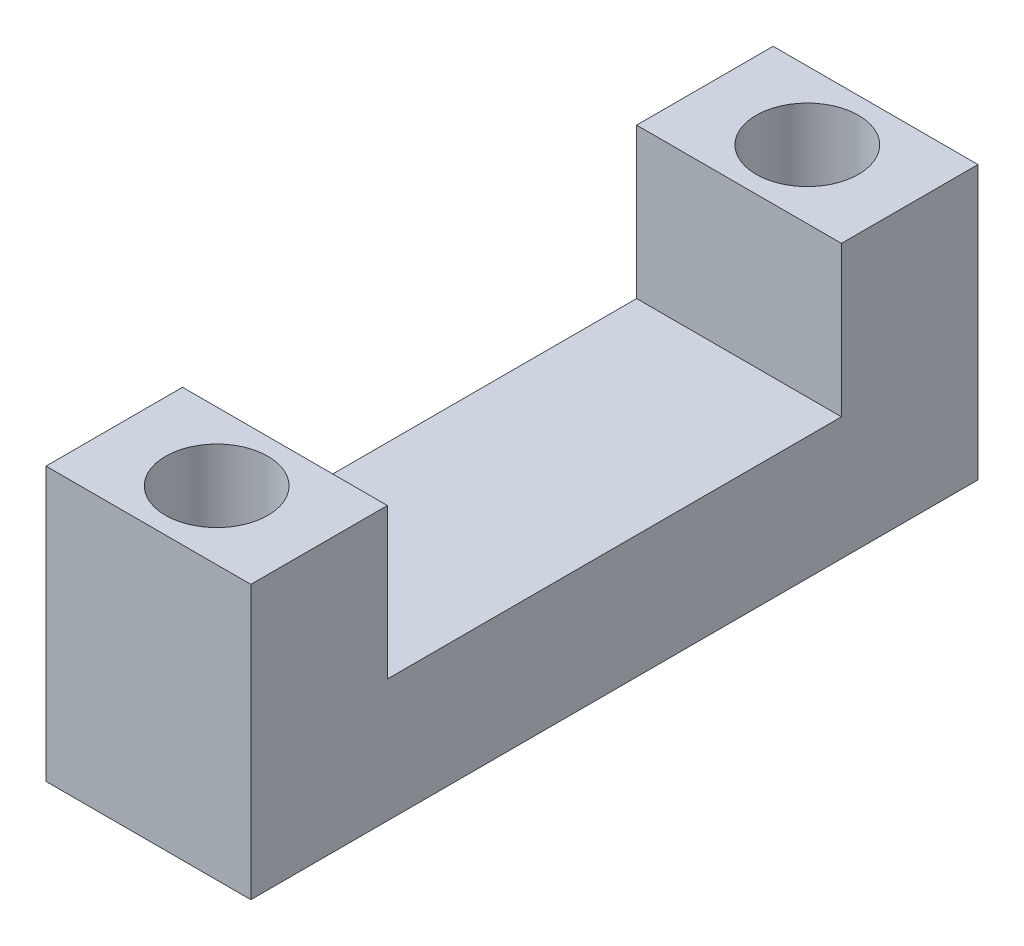
ISO-10303-21;
HEADER;
FILE_DESCRIPTION(('STEP AP214'),'2;1');
FILE_NAME('part.step','',(''),(''),'','','');
FILE_SCHEMA(('AUTOMOTIVE_DESIGN { 1 0 10303 214 1 1 1 1 }'));
ENDSEC;
DATA;
#1=APPLICATION_CONTEXT('core data for automotive mechanical design processes');
#2=APPLICATION_PROTOCOL_DEFINITION('international standard','automotive_design',2000,#1);
#3=PRODUCT_CONTEXT('',#1,'mechanical');
#4=PRODUCT('Part','Part','',(#3));
#5=PRODUCT_RELATED_PRODUCT_CATEGORY('part','',(#4));
#6=PRODUCT_DEFINITION_FORMATION('','',#4);
#7=PRODUCT_DEFINITION_CONTEXT('part definition',#1,'design');
#8=PRODUCT_DEFINITION('design','',#6,#7);
#9=PRODUCT_DEFINITION_SHAPE('','',#8);
#10=(LENGTH_UNIT() NAMED_UNIT(*) SI_UNIT(.MILLI.,.METRE.));
#11=(NAMED_UNIT(*) PLANE_ANGLE_UNIT() SI_UNIT($,.RADIAN.));
#12=(NAMED_UNIT(*) SI_UNIT($,.STERADIAN.) SOLID_ANGLE_UNIT());
#13=UNCERTAINTY_MEASURE_WITH_UNIT(LENGTH_MEASURE(1.E-05),#10,'distance_accuracy_value','');
#14=(GEOMETRIC_REPRESENTATION_CONTEXT(3) GLOBAL_UNCERTAINTY_ASSIGNED_CONTEXT((#13)) GLOBAL_UNIT_ASSIGNED_CONTEXT((#10,
#11,#12)) REPRESENTATION_CONTEXT('',''));
#15=CARTESIAN_POINT('',(0.,0.,0.));
#16=DIRECTION('',(0.,0.,1.));
#17=DIRECTION('',(1.,0.,0.));
#18=AXIS2_PLACEMENT_3D('',#15,#16,#17);
#19=CARTESIAN_POINT('',(6.,0.,-21.3));
#20=DIRECTION('',(0.,1.,0.));
#21=DIRECTION('',(0.,0.,1.));
#22=AXIS2_PLACEMENT_3D('',#19,#20,#21);
#23=PLANE('',#22);
#24=CARTESIAN_POINT('',(3.,0.,-2.));
#25=DIRECTION('',(0.,1.,0.));
#26=DIRECTION('',(0.,0.,1.));
#27=AXIS2_PLACEMENT_3D('',#24,#25,#26);
#28=CIRCLE('',#27,1.5);
#29=CARTESIAN_POINT('',(3.,0.,-0.500000000000002));
#30=VERTEX_POINT('',#29);
#31=EDGE_CURVE('E185',#30,#30,#28,.T.);
#32=ORIENTED_EDGE('',*,*,#31,.T.);
#33=EDGE_LOOP('',(#32));
#34=FACE_BOUND('',#33,.T.);
#35=CARTESIAN_POINT('',(3.,0.,-19.3));
#36=DIRECTION('',(0.,1.,0.));
#37=DIRECTION('',(0.,0.,1.));
#38=AXIS2_PLACEMENT_3D('',#35,#36,#37);
#39=CIRCLE('',#38,1.5);
#40=CARTESIAN_POINT('',(3.,0.,-17.8));
#41=VERTEX_POINT('',#40);
#42=EDGE_CURVE('E136',#41,#41,#39,.T.);
#43=ORIENTED_EDGE('',*,*,#42,.T.);
#44=EDGE_LOOP('',(#43));
#45=FACE_BOUND('',#44,.T.);
#46=DIRECTION('',(0.,0.,-1.));
#47=VECTOR('',#46,1.);
#48=CARTESIAN_POINT('',(0.,0.,-21.3));
#49=LINE('',#48,#47);
#50=CARTESIAN_POINT('',(0.,0.,0.));
#51=VERTEX_POINT('',#50);
#52=CARTESIAN_POINT('',(0.,0.,-21.3));
#53=VERTEX_POINT('',#52);
#54=EDGE_CURVE('E132',#51,#53,#49,.T.);
#55=ORIENTED_EDGE('',*,*,#54,.T.);
#56=DIRECTION('',(-1.,0.,0.));
#57=VECTOR('',#56,1.);
#58=CARTESIAN_POINT('',(6.,0.,-21.3));
#59=LINE('',#58,#57);
#60=CARTESIAN_POINT('',(6.,0.,-21.3));
#61=VERTEX_POINT('',#60);
#62=EDGE_CURVE('E11',#61,#53,#59,.T.);
#63=ORIENTED_EDGE('',*,*,#62,.F.);
#64=DIRECTION('',(0.,0.,-1.));
#65=VECTOR('',#64,1.);
#66=CARTESIAN_POINT('',(6.,0.,-21.3));
#67=LINE('',#66,#65);
#68=CARTESIAN_POINT('',(6.,0.,0.));
#69=VERTEX_POINT('',#68);
#70=EDGE_CURVE('E147',#69,#61,#67,.T.);
#71=ORIENTED_EDGE('',*,*,#70,.F.);
#72=DIRECTION('',(-1.,0.,0.));
#73=VECTOR('',#72,1.);
#74=CARTESIAN_POINT('',(6.,0.,0.));
#75=LINE('',#74,#73);
#76=EDGE_CURVE('E128',#69,#51,#75,.T.);
#77=ORIENTED_EDGE('',*,*,#76,.T.);
#78=EDGE_LOOP('',(#55,#63,#71,#77));
#79=FACE_BOUND('',#78,.T.);
#80=ADVANCED_FACE('F36',(#34,#45,#79),#23,.F.);
#81=CARTESIAN_POINT('',(6.,8.,-21.3));
#82=DIRECTION('',(0.,0.,1.));
#83=DIRECTION('',(0.,-1.,0.));
#84=AXIS2_PLACEMENT_3D('',#81,#82,#83);
#85=PLANE('',#84);
#86=DIRECTION('',(0.,1.,0.));
#87=VECTOR('',#86,1.);
#88=CARTESIAN_POINT('',(0.,8.,-21.3));
#89=LINE('',#88,#87);
#90=CARTESIAN_POINT('',(0.,8.,-21.3));
#91=VERTEX_POINT('',#90);
#92=EDGE_CURVE('E135',#53,#91,#89,.T.);
#93=ORIENTED_EDGE('',*,*,#92,.T.);
#94=DIRECTION('',(-1.,0.,0.));
#95=VECTOR('',#94,1.);
#96=CARTESIAN_POINT('',(6.,8.,-21.3));
#97=LINE('',#96,#95);
#98=CARTESIAN_POINT('',(6.,8.,-21.3));
#99=VERTEX_POINT('',#98);
#100=EDGE_CURVE('E44',#99,#91,#97,.T.);
#101=ORIENTED_EDGE('',*,*,#100,.F.);
#102=DIRECTION('',(0.,1.,0.));
#103=VECTOR('',#102,1.);
#104=CARTESIAN_POINT('',(6.,8.,-21.3));
#105=LINE('',#104,#103);
#106=EDGE_CURVE('E95',#61,#99,#105,.T.);
#107=ORIENTED_EDGE('',*,*,#106,.F.);
#108=ORIENTED_EDGE('',*,*,#62,.T.);
#109=EDGE_LOOP('',(#93,#101,#107,#108));
#110=FACE_BOUND('',#109,.T.);
#111=ADVANCED_FACE('F204',(#110),#85,.F.);
#112=CARTESIAN_POINT('',(6.,8.,-17.3));
#113=DIRECTION('',(0.,-1.,0.));
#114=DIRECTION('',(0.,0.,-1.));
#115=AXIS2_PLACEMENT_3D('',#112,#113,#114);
#116=PLANE('',#115);
#117=CARTESIAN_POINT('',(3.,8.,-19.3));
#118=DIRECTION('',(0.,1.,0.));
#119=DIRECTION('',(0.,0.,1.));
#120=AXIS2_PLACEMENT_3D('',#117,#118,#119);
#121=CIRCLE('',#120,1.5);
#122=CARTESIAN_POINT('',(3.,8.,-17.8));
#123=VERTEX_POINT('',#122);
#124=EDGE_CURVE('E182',#123,#123,#121,.T.);
#125=ORIENTED_EDGE('',*,*,#124,.F.);
#126=EDGE_LOOP('',(#125));
#127=FACE_BOUND('',#126,.T.);
#128=DIRECTION('',(0.,0.,1.));
#129=VECTOR('',#128,1.);
#130=CARTESIAN_POINT('',(0.,8.,-17.3));
#131=LINE('',#130,#129);
#132=CARTESIAN_POINT('',(0.,8.,-17.3));
#133=VERTEX_POINT('',#132);
#134=EDGE_CURVE('E138',#91,#133,#131,.T.);
#135=ORIENTED_EDGE('',*,*,#134,.T.);
#136=DIRECTION('',(-1.,0.,0.));
#137=VECTOR('',#136,1.);
#138=CARTESIAN_POINT('',(6.,8.,-17.3));
#139=LINE('',#138,#137);
#140=CARTESIAN_POINT('',(6.,8.,-17.3));
#141=VERTEX_POINT('',#140);
#142=EDGE_CURVE('E154',#141,#133,#139,.T.);
#143=ORIENTED_EDGE('',*,*,#142,.F.);
#144=DIRECTION('',(0.,0.,1.));
#145=VECTOR('',#144,1.);
#146=CARTESIAN_POINT('',(6.,8.,-17.3));
#147=LINE('',#146,#145);
#148=EDGE_CURVE('E162',#99,#141,#147,.T.);
#149=ORIENTED_EDGE('',*,*,#148,.F.);
#150=ORIENTED_EDGE('',*,*,#100,.T.);
#151=EDGE_LOOP('',(#135,#143,#149,#150));
#152=FACE_BOUND('',#151,.T.);
#153=ADVANCED_FACE('F160',(#127,#152),#116,.F.);
#154=CARTESIAN_POINT('',(6.,3.6,-17.3));
#155=DIRECTION('',(0.,0.,-1.));
#156=DIRECTION('',(-1.,0.,0.));
#157=AXIS2_PLACEMENT_3D('',#154,#155,#156);
#158=PLANE('',#157);
#159=DIRECTION('',(0.,-1.,0.));
#160=VECTOR('',#159,1.);
#161=CARTESIAN_POINT('',(0.,3.6,-17.3));
#162=LINE('',#161,#160);
#163=CARTESIAN_POINT('',(0.,3.6,-17.3));
#164=VERTEX_POINT('',#163);
#165=EDGE_CURVE('E140',#133,#164,#162,.T.);
#166=ORIENTED_EDGE('',*,*,#165,.T.);
#167=DIRECTION('',(-1.,0.,0.));
#168=VECTOR('',#167,1.);
#169=CARTESIAN_POINT('',(6.,3.6,-17.3));
#170=LINE('',#169,#168);
#171=CARTESIAN_POINT('',(6.,3.6,-17.3));
#172=VERTEX_POINT('',#171);
#173=EDGE_CURVE('E151',#172,#164,#170,.T.);
#174=ORIENTED_EDGE('',*,*,#173,.F.);
#175=DIRECTION('',(0.,-1.,0.));
#176=VECTOR('',#175,1.);
#177=CARTESIAN_POINT('',(6.,3.6,-17.3));
#178=LINE('',#177,#176);
#179=EDGE_CURVE('E174',#141,#172,#178,.T.);
#180=ORIENTED_EDGE('',*,*,#179,.F.);
#181=ORIENTED_EDGE('',*,*,#142,.T.);
#182=EDGE_LOOP('',(#166,#174,#180,#181));
#183=FACE_BOUND('',#182,.T.);
#184=ADVANCED_FACE('F170',(#183),#158,.F.);
#185=CARTESIAN_POINT('',(6.,3.6,-4.));
#186=DIRECTION('',(0.,-1.,0.));
#187=DIRECTION('',(0.,0.,-1.));
#188=AXIS2_PLACEMENT_3D('',#185,#186,#187);
#189=PLANE('',#188);
#190=DIRECTION('',(0.,0.,1.));
#191=VECTOR('',#190,1.);
#192=CARTESIAN_POINT('',(0.,3.6,-4.));
#193=LINE('',#192,#191);
#194=CARTESIAN_POINT('',(0.,3.6,-4.));
#195=VERTEX_POINT('',#194);
#196=EDGE_CURVE('E142',#164,#195,#193,.T.);
#197=ORIENTED_EDGE('',*,*,#196,.T.);
#198=DIRECTION('',(-1.,0.,0.));
#199=VECTOR('',#198,1.);
#200=CARTESIAN_POINT('',(6.,3.6,-4.));
#201=LINE('',#200,#199);
#202=CARTESIAN_POINT('',(6.,3.6,-4.));
#203=VERTEX_POINT('',#202);
#204=EDGE_CURVE('E123',#203,#195,#201,.T.);
#205=ORIENTED_EDGE('',*,*,#204,.F.);
#206=DIRECTION('',(0.,0.,1.));
#207=VECTOR('',#206,1.);
#208=CARTESIAN_POINT('',(6.,3.6,-4.));
#209=LINE('',#208,#207);
#210=EDGE_CURVE('E114',#172,#203,#209,.T.);
#211=ORIENTED_EDGE('',*,*,#210,.F.);
#212=ORIENTED_EDGE('',*,*,#173,.T.);
#213=EDGE_LOOP('',(#197,#205,#211,#212));
#214=FACE_BOUND('',#213,.T.);
#215=ADVANCED_FACE('F173',(#214),#189,.F.);
#216=CARTESIAN_POINT('',(6.,8.,-4.));
#217=DIRECTION('',(0.,0.,1.));
#218=DIRECTION('',(0.,-1.,0.));
#219=AXIS2_PLACEMENT_3D('',#216,#217,#218);
#220=PLANE('',#219);
#221=DIRECTION('',(0.,1.,0.));
#222=VECTOR('',#221,1.);
#223=CARTESIAN_POINT('',(0.,8.,-4.));
#224=LINE('',#223,#222);
#225=CARTESIAN_POINT('',(0.,8.,-4.));
#226=VERTEX_POINT('',#225);
#227=EDGE_CURVE('E122',#195,#226,#224,.T.);
#228=ORIENTED_EDGE('',*,*,#227,.T.);
#229=DIRECTION('',(-1.,0.,0.));
#230=VECTOR('',#229,1.);
#231=CARTESIAN_POINT('',(6.,8.,-4.));
#232=LINE('',#231,#230);
#233=CARTESIAN_POINT('',(6.,8.,-4.));
#234=VERTEX_POINT('',#233);
#235=EDGE_CURVE('E119',#234,#226,#232,.T.);
#236=ORIENTED_EDGE('',*,*,#235,.F.);
#237=DIRECTION('',(0.,1.,0.));
#238=VECTOR('',#237,1.);
#239=CARTESIAN_POINT('',(6.,8.,-4.));
#240=LINE('',#239,#238);
#241=EDGE_CURVE('E108',#203,#234,#240,.T.);
#242=ORIENTED_EDGE('',*,*,#241,.F.);
#243=ORIENTED_EDGE('',*,*,#204,.T.);
#244=EDGE_LOOP('',(#228,#236,#242,#243));
#245=FACE_BOUND('',#244,.T.);
#246=ADVANCED_FACE('F120',(#245),#220,.F.);
#247=CARTESIAN_POINT('',(6.,8.,0.));
#248=DIRECTION('',(0.,-1.,0.));
#249=DIRECTION('',(0.,0.,-1.));
#250=AXIS2_PLACEMENT_3D('',#247,#248,#249);
#251=PLANE('',#250);
#252=CARTESIAN_POINT('',(3.,8.,-2.));
#253=DIRECTION('',(0.,1.,0.));
#254=DIRECTION('',(0.,0.,1.));
#255=AXIS2_PLACEMENT_3D('',#252,#253,#254);
#256=CIRCLE('',#255,1.5);
#257=CARTESIAN_POINT('',(3.,8.,-0.500000000000001));
#258=VERTEX_POINT('',#257);
#259=EDGE_CURVE('E188',#258,#258,#256,.T.);
#260=ORIENTED_EDGE('',*,*,#259,.F.);
#261=EDGE_LOOP('',(#260));
#262=FACE_BOUND('',#261,.T.);
#263=DIRECTION('',(0.,0.,1.));
#264=VECTOR('',#263,1.);
#265=CARTESIAN_POINT('',(0.,8.,0.));
#266=LINE('',#265,#264);
#267=CARTESIAN_POINT('',(0.,8.,0.));
#268=VERTEX_POINT('',#267);
#269=EDGE_CURVE('E81',#226,#268,#266,.T.);
#270=ORIENTED_EDGE('',*,*,#269,.T.);
#271=DIRECTION('',(-1.,0.,0.));
#272=VECTOR('',#271,1.);
#273=CARTESIAN_POINT('',(6.,8.,0.));
#274=LINE('',#273,#272);
#275=CARTESIAN_POINT('',(6.,8.,0.));
#276=VERTEX_POINT('',#275);
#277=EDGE_CURVE('E124',#276,#268,#274,.T.);
#278=ORIENTED_EDGE('',*,*,#277,.F.);
#279=DIRECTION('',(0.,0.,1.));
#280=VECTOR('',#279,1.);
#281=CARTESIAN_POINT('',(6.,8.,0.));
#282=LINE('',#281,#280);
#283=EDGE_CURVE('E112',#234,#276,#282,.T.);
#284=ORIENTED_EDGE('',*,*,#283,.F.);
#285=ORIENTED_EDGE('',*,*,#235,.T.);
#286=EDGE_LOOP('',(#270,#278,#284,#285));
#287=FACE_BOUND('',#286,.T.);
#288=ADVANCED_FACE('F126',(#262,#287),#251,.F.);
#289=CARTESIAN_POINT('',(6.,0.,0.));
#290=DIRECTION('',(0.,0.,-1.));
#291=DIRECTION('',(0.,1.,0.));
#292=AXIS2_PLACEMENT_3D('',#289,#290,#291);
#293=PLANE('',#292);
#294=DIRECTION('',(0.,-1.,0.));
#295=VECTOR('',#294,1.);
#296=CARTESIAN_POINT('',(0.,0.,0.));
#297=LINE('',#296,#295);
#298=EDGE_CURVE('E87',#268,#51,#297,.T.);
#299=ORIENTED_EDGE('',*,*,#298,.T.);
#300=ORIENTED_EDGE('',*,*,#76,.F.);
#301=DIRECTION('',(0.,-1.,0.));
#302=VECTOR('',#301,1.);
#303=CARTESIAN_POINT('',(6.,0.,0.));
#304=LINE('',#303,#302);
#305=EDGE_CURVE('E52',#276,#69,#304,.T.);
#306=ORIENTED_EDGE('',*,*,#305,.F.);
#307=ORIENTED_EDGE('',*,*,#277,.T.);
#308=EDGE_LOOP('',(#299,#300,#306,#307));
#309=FACE_BOUND('',#308,.T.);
#310=ADVANCED_FACE('F195',(#309),#293,.F.);
#311=CARTESIAN_POINT('',(6.,0.,0.));
#312=DIRECTION('',(-1.,0.,0.));
#313=DIRECTION('',(0.,0.,1.));
#314=AXIS2_PLACEMENT_3D('',#311,#312,#313);
#315=PLANE('',#314);
#316=ORIENTED_EDGE('',*,*,#70,.T.);
#317=ORIENTED_EDGE('',*,*,#106,.T.);
#318=ORIENTED_EDGE('',*,*,#148,.T.);
#319=ORIENTED_EDGE('',*,*,#179,.T.);
#320=ORIENTED_EDGE('',*,*,#210,.T.);
#321=ORIENTED_EDGE('',*,*,#241,.T.);
#322=ORIENTED_EDGE('',*,*,#283,.T.);
#323=ORIENTED_EDGE('',*,*,#305,.T.);
#324=EDGE_LOOP('',(#316,#317,#318,#319,#320,#321,#322,#323));
#325=FACE_BOUND('',#324,.T.);
#326=ADVANCED_FACE('F110',(#325),#315,.F.);
#327=CARTESIAN_POINT('',(0.,0.,0.));
#328=DIRECTION('',(-1.,0.,0.));
#329=DIRECTION('',(0.,0.,1.));
#330=AXIS2_PLACEMENT_3D('',#327,#328,#329);
#331=PLANE('',#330);
#332=ORIENTED_EDGE('',*,*,#54,.F.);
#333=ORIENTED_EDGE('',*,*,#298,.F.);
#334=ORIENTED_EDGE('',*,*,#269,.F.);
#335=ORIENTED_EDGE('',*,*,#227,.F.);
#336=ORIENTED_EDGE('',*,*,#196,.F.);
#337=ORIENTED_EDGE('',*,*,#165,.F.);
#338=ORIENTED_EDGE('',*,*,#134,.F.);
#339=ORIENTED_EDGE('',*,*,#92,.F.);
#340=EDGE_LOOP('',(#332,#333,#334,#335,#336,#337,#338,#339));
#341=FACE_BOUND('',#340,.T.);
#342=ADVANCED_FACE('F166',(#341),#331,.T.);
#343=CARTESIAN_POINT('',(3.,8.,-19.3));
#344=DIRECTION('',(0.,1.,0.));
#345=DIRECTION('',(0.,0.,1.));
#346=AXIS2_PLACEMENT_3D('',#343,#344,#345);
#347=CYLINDRICAL_SURFACE('',#346,1.5);
#348=ORIENTED_EDGE('',*,*,#42,.F.);
#349=EDGE_LOOP('',(#348));
#350=FACE_BOUND('',#349,.T.);
#351=ORIENTED_EDGE('',*,*,#124,.T.);
#352=EDGE_LOOP('',(#351));
#353=FACE_BOUND('',#352,.T.);
#354=ADVANCED_FACE('F216',(#350,#353),#347,.F.);
#355=CARTESIAN_POINT('',(3.,8.,-2.));
#356=DIRECTION('',(0.,1.,0.));
#357=DIRECTION('',(0.,0.,1.));
#358=AXIS2_PLACEMENT_3D('',#355,#356,#357);
#359=CYLINDRICAL_SURFACE('',#358,1.5);
#360=ORIENTED_EDGE('',*,*,#31,.F.);
#361=EDGE_LOOP('',(#360));
#362=FACE_BOUND('',#361,.T.);
#363=ORIENTED_EDGE('',*,*,#259,.T.);
#364=EDGE_LOOP('',(#363));
#365=FACE_BOUND('',#364,.T.);
#366=ADVANCED_FACE('F192',(#362,#365),#359,.F.);
#367=CLOSED_SHELL('',(#80,#111,#153,#184,#215,#246,#288,#310,#326,#342,#354,#366));
#368=MANIFOLD_SOLID_BREP('B2',#367);
#369=ADVANCED_BREP_SHAPE_REPRESENTATION('',(#18,#368),#14);
#370=SHAPE_DEFINITION_REPRESENTATION(#9,#369);
ENDSEC;
END-ISO-10303-21;
